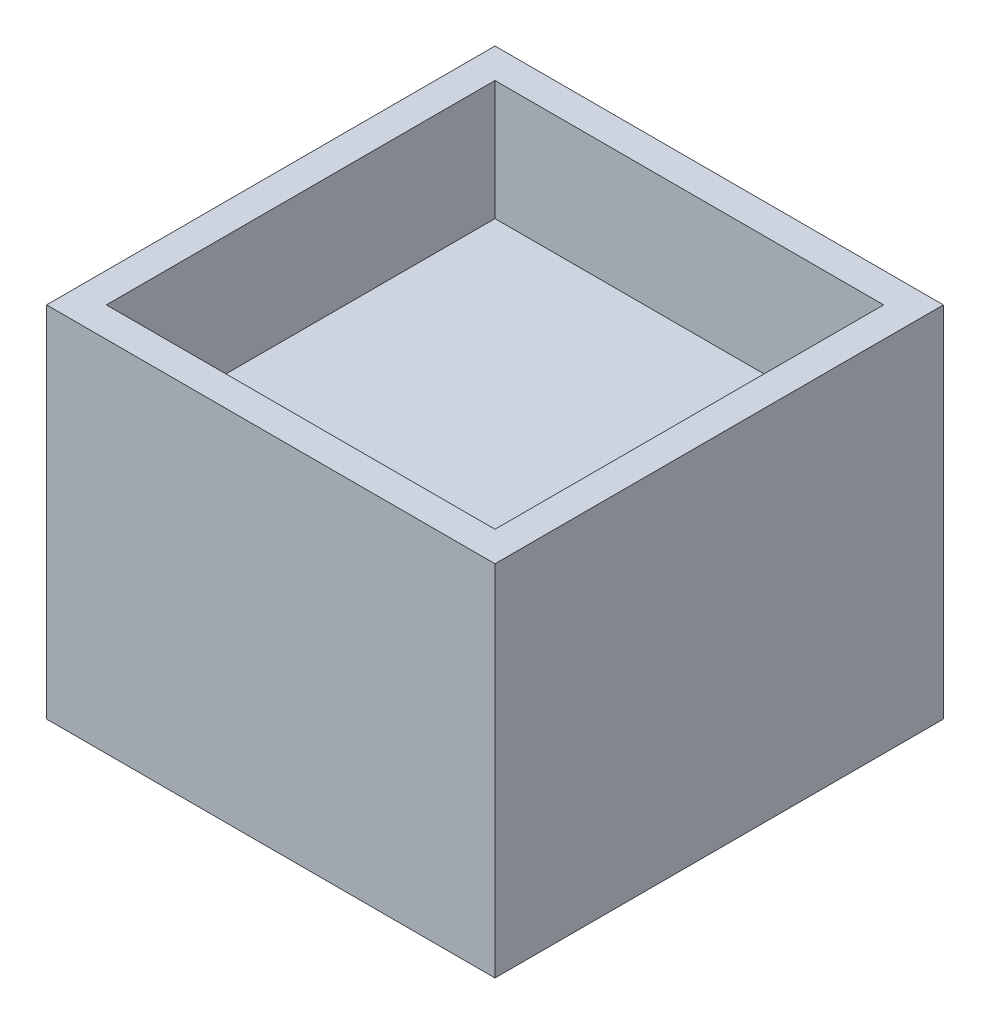
ISO-10303-21;
HEADER;
FILE_DESCRIPTION(('STEP AP214'),'2;1');
FILE_NAME('part.step','',(''),(''),'','','');
FILE_SCHEMA(('AUTOMOTIVE_DESIGN { 1 0 10303 214 1 1 1 1 }'));
ENDSEC;
DATA;
#1=APPLICATION_CONTEXT('core data for automotive mechanical design processes');
#2=APPLICATION_PROTOCOL_DEFINITION('international standard','automotive_design',2000,#1);
#3=PRODUCT_CONTEXT('',#1,'mechanical');
#4=PRODUCT('Part','Part','',(#3));
#5=PRODUCT_RELATED_PRODUCT_CATEGORY('part','',(#4));
#6=PRODUCT_DEFINITION_FORMATION('','',#4);
#7=PRODUCT_DEFINITION_CONTEXT('part definition',#1,'design');
#8=PRODUCT_DEFINITION('design','',#6,#7);
#9=PRODUCT_DEFINITION_SHAPE('','',#8);
#10=(LENGTH_UNIT() NAMED_UNIT(*) SI_UNIT(.MILLI.,.METRE.));
#11=(NAMED_UNIT(*) PLANE_ANGLE_UNIT() SI_UNIT($,.RADIAN.));
#12=(NAMED_UNIT(*) SI_UNIT($,.STERADIAN.) SOLID_ANGLE_UNIT());
#13=UNCERTAINTY_MEASURE_WITH_UNIT(LENGTH_MEASURE(1.E-05),#10,'distance_accuracy_value','');
#14=(GEOMETRIC_REPRESENTATION_CONTEXT(3) GLOBAL_UNCERTAINTY_ASSIGNED_CONTEXT((#13)) GLOBAL_UNIT_ASSIGNED_CONTEXT((#10,
#11,#12)) REPRESENTATION_CONTEXT('',''));
#15=CARTESIAN_POINT('',(0.,0.,0.));
#16=DIRECTION('',(0.,0.,1.));
#17=DIRECTION('',(1.,0.,0.));
#18=AXIS2_PLACEMENT_3D('',#15,#16,#17);
#19=CARTESIAN_POINT('',(-375.,600.,375.));
#20=DIRECTION('',(1.,0.,0.));
#21=DIRECTION('',(0.,0.,-1.));
#22=AXIS2_PLACEMENT_3D('',#19,#20,#21);
#23=PLANE('',#22);
#24=DIRECTION('',(0.,0.,1.));
#25=VECTOR('',#24,1.);
#26=CARTESIAN_POINT('',(-375.,0.,375.));
#27=LINE('',#26,#25);
#28=CARTESIAN_POINT('',(-375.,0.,-375.));
#29=VERTEX_POINT('',#28);
#30=CARTESIAN_POINT('',(-375.,0.,375.));
#31=VERTEX_POINT('',#30);
#32=EDGE_CURVE('E141',#29,#31,#27,.T.);
#33=ORIENTED_EDGE('',*,*,#32,.T.);
#34=DIRECTION('',(0.,-1.,0.));
#35=VECTOR('',#34,1.);
#36=CARTESIAN_POINT('',(-375.,600.,375.));
#37=LINE('',#36,#35);
#38=CARTESIAN_POINT('',(-375.,600.,375.));
#39=VERTEX_POINT('',#38);
#40=EDGE_CURVE('E11',#39,#31,#37,.T.);
#41=ORIENTED_EDGE('',*,*,#40,.F.);
#42=DIRECTION('',(0.,0.,1.));
#43=VECTOR('',#42,1.);
#44=CARTESIAN_POINT('',(-375.,600.,375.));
#45=LINE('',#44,#43);
#46=CARTESIAN_POINT('',(-375.,600.,-375.));
#47=VERTEX_POINT('',#46);
#48=EDGE_CURVE('E145',#47,#39,#45,.T.);
#49=ORIENTED_EDGE('',*,*,#48,.F.);
#50=DIRECTION('',(0.,-1.,0.));
#51=VECTOR('',#50,1.);
#52=CARTESIAN_POINT('',(-375.,600.,-375.));
#53=LINE('',#52,#51);
#54=EDGE_CURVE('E151',#47,#29,#53,.T.);
#55=ORIENTED_EDGE('',*,*,#54,.T.);
#56=EDGE_LOOP('',(#33,#41,#49,#55));
#57=FACE_BOUND('',#56,.T.);
#58=ADVANCED_FACE('F33',(#57),#23,.F.);
#59=CARTESIAN_POINT('',(375.,600.,375.));
#60=DIRECTION('',(0.,0.,-1.));
#61=DIRECTION('',(-1.,0.,0.));
#62=AXIS2_PLACEMENT_3D('',#59,#60,#61);
#63=PLANE('',#62);
#64=DIRECTION('',(1.,0.,0.));
#65=VECTOR('',#64,1.);
#66=CARTESIAN_POINT('',(375.,0.,375.));
#67=LINE('',#66,#65);
#68=CARTESIAN_POINT('',(375.,0.,375.));
#69=VERTEX_POINT('',#68);
#70=EDGE_CURVE('E154',#31,#69,#67,.T.);
#71=ORIENTED_EDGE('',*,*,#70,.T.);
#72=DIRECTION('',(0.,-1.,0.));
#73=VECTOR('',#72,1.);
#74=CARTESIAN_POINT('',(375.,600.,375.));
#75=LINE('',#74,#73);
#76=CARTESIAN_POINT('',(375.,600.,375.));
#77=VERTEX_POINT('',#76);
#78=EDGE_CURVE('E40',#77,#69,#75,.T.);
#79=ORIENTED_EDGE('',*,*,#78,.F.);
#80=DIRECTION('',(1.,0.,0.));
#81=VECTOR('',#80,1.);
#82=CARTESIAN_POINT('',(375.,600.,375.));
#83=LINE('',#82,#81);
#84=EDGE_CURVE('E84',#39,#77,#83,.T.);
#85=ORIENTED_EDGE('',*,*,#84,.F.);
#86=ORIENTED_EDGE('',*,*,#40,.T.);
#87=EDGE_LOOP('',(#71,#79,#85,#86));
#88=FACE_BOUND('',#87,.T.);
#89=ADVANCED_FACE('F183',(#88),#63,.F.);
#90=CARTESIAN_POINT('',(375.,600.,375.));
#91=DIRECTION('',(-1.,0.,0.));
#92=DIRECTION('',(0.,0.,1.));
#93=AXIS2_PLACEMENT_3D('',#90,#91,#92);
#94=PLANE('',#93);
#95=DIRECTION('',(0.,0.,-1.));
#96=VECTOR('',#95,1.);
#97=CARTESIAN_POINT('',(375.,0.,375.));
#98=LINE('',#97,#96);
#99=CARTESIAN_POINT('',(375.,0.,-375.));
#100=VERTEX_POINT('',#99);
#101=EDGE_CURVE('E156',#69,#100,#98,.T.);
#102=ORIENTED_EDGE('',*,*,#101,.T.);
#103=DIRECTION('',(0.,-1.,0.));
#104=VECTOR('',#103,1.);
#105=CARTESIAN_POINT('',(375.,600.,-375.));
#106=LINE('',#105,#104);
#107=CARTESIAN_POINT('',(375.,600.,-375.));
#108=VERTEX_POINT('',#107);
#109=EDGE_CURVE('E160',#108,#100,#106,.T.);
#110=ORIENTED_EDGE('',*,*,#109,.F.);
#111=DIRECTION('',(0.,0.,-1.));
#112=VECTOR('',#111,1.);
#113=CARTESIAN_POINT('',(375.,600.,375.));
#114=LINE('',#113,#112);
#115=EDGE_CURVE('E148',#77,#108,#114,.T.);
#116=ORIENTED_EDGE('',*,*,#115,.F.);
#117=ORIENTED_EDGE('',*,*,#78,.T.);
#118=EDGE_LOOP('',(#102,#110,#116,#117));
#119=FACE_BOUND('',#118,.T.);
#120=ADVANCED_FACE('F165',(#119),#94,.F.);
#121=CARTESIAN_POINT('',(375.,600.,-375.));
#122=DIRECTION('',(0.,0.,1.));
#123=DIRECTION('',(1.,0.,0.));
#124=AXIS2_PLACEMENT_3D('',#121,#122,#123);
#125=PLANE('',#124);
#126=DIRECTION('',(-1.,0.,0.));
#127=VECTOR('',#126,1.);
#128=CARTESIAN_POINT('',(375.,0.,-375.));
#129=LINE('',#128,#127);
#130=EDGE_CURVE('E77',#100,#29,#129,.T.);
#131=ORIENTED_EDGE('',*,*,#130,.T.);
#132=ORIENTED_EDGE('',*,*,#54,.F.);
#133=DIRECTION('',(-1.,0.,0.));
#134=VECTOR('',#133,1.);
#135=CARTESIAN_POINT('',(375.,600.,-375.));
#136=LINE('',#135,#134);
#137=EDGE_CURVE('E56',#108,#47,#136,.T.);
#138=ORIENTED_EDGE('',*,*,#137,.F.);
#139=ORIENTED_EDGE('',*,*,#109,.T.);
#140=EDGE_LOOP('',(#131,#132,#138,#139));
#141=FACE_BOUND('',#140,.T.);
#142=ADVANCED_FACE('F173',(#141),#125,.F.);
#143=CARTESIAN_POINT('',(0.,600.,0.));
#144=DIRECTION('',(0.,1.,0.));
#145=DIRECTION('',(0.,0.,1.));
#146=AXIS2_PLACEMENT_3D('',#143,#144,#145);
#147=PLANE('',#146);
#148=DIRECTION('',(0.,0.,1.));
#149=VECTOR('',#148,1.);
#150=CARTESIAN_POINT('',(-325.,600.,325.));
#151=LINE('',#150,#149);
#152=CARTESIAN_POINT('',(-325.,600.,-325.));
#153=VERTEX_POINT('',#152);
#154=CARTESIAN_POINT('',(-325.,600.,325.));
#155=VERTEX_POINT('',#154);
#156=EDGE_CURVE('E47',#153,#155,#151,.T.);
#157=ORIENTED_EDGE('',*,*,#156,.F.);
#158=DIRECTION('',(-1.,0.,0.));
#159=VECTOR('',#158,1.);
#160=CARTESIAN_POINT('',(325.,600.,-325.));
#161=LINE('',#160,#159);
#162=CARTESIAN_POINT('',(325.,600.,-325.));
#163=VERTEX_POINT('',#162);
#164=EDGE_CURVE('E126',#163,#153,#161,.T.);
#165=ORIENTED_EDGE('',*,*,#164,.F.);
#166=DIRECTION('',(0.,0.,-1.));
#167=VECTOR('',#166,1.);
#168=CARTESIAN_POINT('',(325.,600.,325.));
#169=LINE('',#168,#167);
#170=CARTESIAN_POINT('',(325.,600.,325.));
#171=VERTEX_POINT('',#170);
#172=EDGE_CURVE('E129',#171,#163,#169,.T.);
#173=ORIENTED_EDGE('',*,*,#172,.F.);
#174=DIRECTION('',(1.,0.,0.));
#175=VECTOR('',#174,1.);
#176=CARTESIAN_POINT('',(325.,600.,325.));
#177=LINE('',#176,#175);
#178=EDGE_CURVE('E135',#155,#171,#177,.T.);
#179=ORIENTED_EDGE('',*,*,#178,.F.);
#180=EDGE_LOOP('',(#157,#165,#173,#179));
#181=FACE_BOUND('',#180,.T.);
#182=ORIENTED_EDGE('',*,*,#48,.T.);
#183=ORIENTED_EDGE('',*,*,#84,.T.);
#184=ORIENTED_EDGE('',*,*,#115,.T.);
#185=ORIENTED_EDGE('',*,*,#137,.T.);
#186=EDGE_LOOP('',(#182,#183,#184,#185));
#187=FACE_BOUND('',#186,.T.);
#188=ADVANCED_FACE('F175',(#181,#187),#147,.T.);
#189=CARTESIAN_POINT('',(0.,0.,0.));
#190=DIRECTION('',(0.,1.,0.));
#191=DIRECTION('',(0.,0.,1.));
#192=AXIS2_PLACEMENT_3D('',#189,#190,#191);
#193=PLANE('',#192);
#194=ORIENTED_EDGE('',*,*,#32,.F.);
#195=ORIENTED_EDGE('',*,*,#130,.F.);
#196=ORIENTED_EDGE('',*,*,#101,.F.);
#197=ORIENTED_EDGE('',*,*,#70,.F.);
#198=EDGE_LOOP('',(#194,#195,#196,#197));
#199=FACE_BOUND('',#198,.T.);
#200=ADVANCED_FACE('F169',(#199),#193,.F.);
#201=CARTESIAN_POINT('',(-325.,400.,325.));
#202=DIRECTION('',(-1.,0.,0.));
#203=DIRECTION('',(0.,0.,1.));
#204=AXIS2_PLACEMENT_3D('',#201,#202,#203);
#205=PLANE('',#204);
#206=ORIENTED_EDGE('',*,*,#156,.T.);
#207=DIRECTION('',(0.,1.,0.));
#208=VECTOR('',#207,1.);
#209=CARTESIAN_POINT('',(-325.,400.,325.));
#210=LINE('',#209,#208);
#211=CARTESIAN_POINT('',(-325.,400.,325.));
#212=VERTEX_POINT('',#211);
#213=EDGE_CURVE('E104',#212,#155,#210,.T.);
#214=ORIENTED_EDGE('',*,*,#213,.F.);
#215=DIRECTION('',(0.,0.,1.));
#216=VECTOR('',#215,1.);
#217=CARTESIAN_POINT('',(-325.,400.,325.));
#218=LINE('',#217,#216);
#219=CARTESIAN_POINT('',(-325.,400.,-325.));
#220=VERTEX_POINT('',#219);
#221=EDGE_CURVE('E108',#220,#212,#218,.T.);
#222=ORIENTED_EDGE('',*,*,#221,.F.);
#223=DIRECTION('',(0.,1.,0.));
#224=VECTOR('',#223,1.);
#225=CARTESIAN_POINT('',(-325.,400.,-325.));
#226=LINE('',#225,#224);
#227=EDGE_CURVE('E139',#220,#153,#226,.T.);
#228=ORIENTED_EDGE('',*,*,#227,.T.);
#229=EDGE_LOOP('',(#206,#214,#222,#228));
#230=FACE_BOUND('',#229,.T.);
#231=ADVANCED_FACE('F106',(#230),#205,.F.);
#232=CARTESIAN_POINT('',(325.,400.,-325.));
#233=DIRECTION('',(0.,0.,-1.));
#234=DIRECTION('',(-1.,0.,0.));
#235=AXIS2_PLACEMENT_3D('',#232,#233,#234);
#236=PLANE('',#235);
#237=ORIENTED_EDGE('',*,*,#164,.T.);
#238=ORIENTED_EDGE('',*,*,#227,.F.);
#239=DIRECTION('',(-1.,0.,0.));
#240=VECTOR('',#239,1.);
#241=CARTESIAN_POINT('',(325.,400.,-325.));
#242=LINE('',#241,#240);
#243=CARTESIAN_POINT('',(325.,400.,-325.));
#244=VERTEX_POINT('',#243);
#245=EDGE_CURVE('E114',#244,#220,#242,.T.);
#246=ORIENTED_EDGE('',*,*,#245,.F.);
#247=DIRECTION('',(0.,1.,0.));
#248=VECTOR('',#247,1.);
#249=CARTESIAN_POINT('',(325.,400.,-325.));
#250=LINE('',#249,#248);
#251=EDGE_CURVE('E142',#244,#163,#250,.T.);
#252=ORIENTED_EDGE('',*,*,#251,.T.);
#253=EDGE_LOOP('',(#237,#238,#246,#252));
#254=FACE_BOUND('',#253,.T.);
#255=ADVANCED_FACE('F222',(#254),#236,.F.);
#256=CARTESIAN_POINT('',(325.,400.,325.));
#257=DIRECTION('',(1.,0.,0.));
#258=DIRECTION('',(0.,0.,-1.));
#259=AXIS2_PLACEMENT_3D('',#256,#257,#258);
#260=PLANE('',#259);
#261=ORIENTED_EDGE('',*,*,#172,.T.);
#262=ORIENTED_EDGE('',*,*,#251,.F.);
#263=DIRECTION('',(0.,0.,-1.));
#264=VECTOR('',#263,1.);
#265=CARTESIAN_POINT('',(325.,400.,325.));
#266=LINE('',#265,#264);
#267=CARTESIAN_POINT('',(325.,400.,325.));
#268=VERTEX_POINT('',#267);
#269=EDGE_CURVE('E122',#268,#244,#266,.T.);
#270=ORIENTED_EDGE('',*,*,#269,.F.);
#271=DIRECTION('',(0.,1.,0.));
#272=VECTOR('',#271,1.);
#273=CARTESIAN_POINT('',(325.,400.,325.));
#274=LINE('',#273,#272);
#275=EDGE_CURVE('E113',#268,#171,#274,.T.);
#276=ORIENTED_EDGE('',*,*,#275,.T.);
#277=EDGE_LOOP('',(#261,#262,#270,#276));
#278=FACE_BOUND('',#277,.T.);
#279=ADVANCED_FACE('F231',(#278),#260,.F.);
#280=CARTESIAN_POINT('',(325.,400.,325.));
#281=DIRECTION('',(0.,0.,1.));
#282=DIRECTION('',(1.,0.,0.));
#283=AXIS2_PLACEMENT_3D('',#280,#281,#282);
#284=PLANE('',#283);
#285=ORIENTED_EDGE('',*,*,#178,.T.);
#286=ORIENTED_EDGE('',*,*,#275,.F.);
#287=DIRECTION('',(1.,0.,0.));
#288=VECTOR('',#287,1.);
#289=CARTESIAN_POINT('',(325.,400.,325.));
#290=LINE('',#289,#288);
#291=EDGE_CURVE('E117',#212,#268,#290,.T.);
#292=ORIENTED_EDGE('',*,*,#291,.F.);
#293=ORIENTED_EDGE('',*,*,#213,.T.);
#294=EDGE_LOOP('',(#285,#286,#292,#293));
#295=FACE_BOUND('',#294,.T.);
#296=ADVANCED_FACE('F118',(#295),#284,.F.);
#297=CARTESIAN_POINT('',(0.,400.,0.));
#298=DIRECTION('',(0.,1.,0.));
#299=DIRECTION('',(0.,0.,1.));
#300=AXIS2_PLACEMENT_3D('',#297,#298,#299);
#301=PLANE('',#300);
#302=ORIENTED_EDGE('',*,*,#221,.T.);
#303=ORIENTED_EDGE('',*,*,#291,.T.);
#304=ORIENTED_EDGE('',*,*,#269,.T.);
#305=ORIENTED_EDGE('',*,*,#245,.T.);
#306=EDGE_LOOP('',(#302,#303,#304,#305));
#307=FACE_BOUND('',#306,.T.);
#308=ADVANCED_FACE('F124',(#307),#301,.T.);
#309=CLOSED_SHELL('',(#58,#89,#120,#142,#188,#200,#231,#255,#279,#296,#308));
#310=MANIFOLD_SOLID_BREP('B2',#309);
#311=ADVANCED_BREP_SHAPE_REPRESENTATION('',(#18,#310),#14);
#312=SHAPE_DEFINITION_REPRESENTATION(#9,#311);
ENDSEC;
END-ISO-10303-21;
